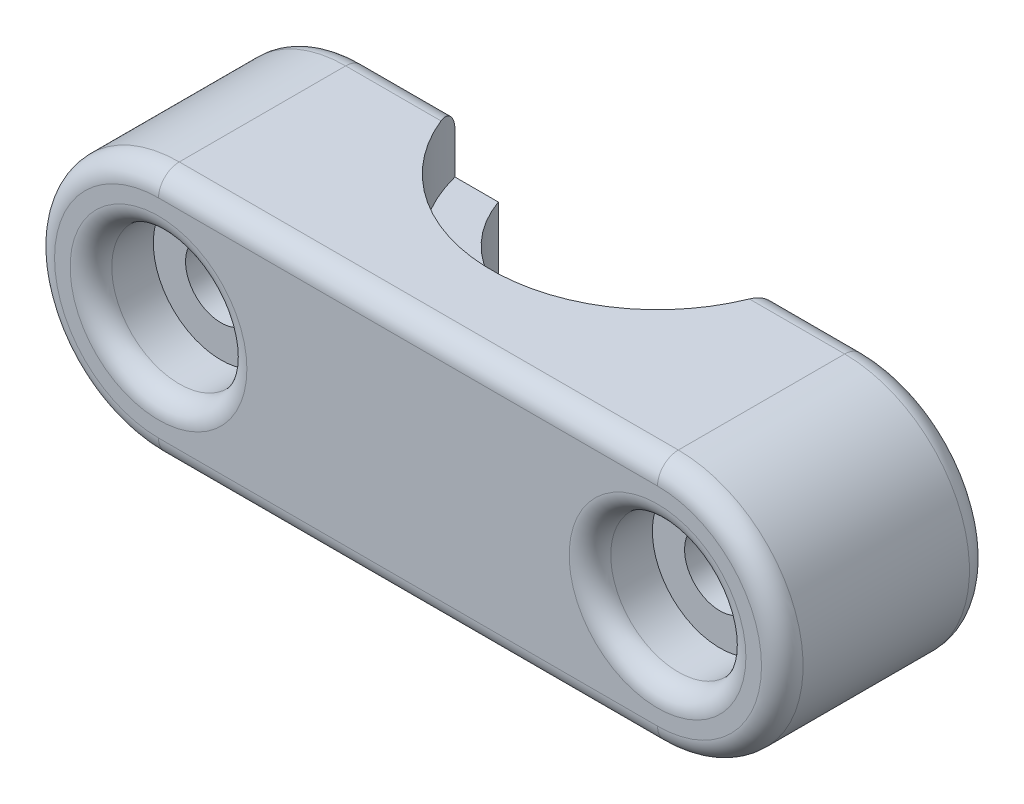
ISO-10303-21;
HEADER;
FILE_DESCRIPTION(('STEP AP214'),'2;1');
FILE_NAME('part.step','',(''),(''),'','','');
FILE_SCHEMA(('AUTOMOTIVE_DESIGN { 1 0 10303 214 1 1 1 1 }'));
ENDSEC;
DATA;
#1=APPLICATION_CONTEXT('core data for automotive mechanical design processes');
#2=APPLICATION_PROTOCOL_DEFINITION('international standard','automotive_design',2000,#1);
#3=PRODUCT_CONTEXT('',#1,'mechanical');
#4=PRODUCT('Part','Part','',(#3));
#5=PRODUCT_RELATED_PRODUCT_CATEGORY('part','',(#4));
#6=PRODUCT_DEFINITION_FORMATION('','',#4);
#7=PRODUCT_DEFINITION_CONTEXT('part definition',#1,'design');
#8=PRODUCT_DEFINITION('design','',#6,#7);
#9=PRODUCT_DEFINITION_SHAPE('','',#8);
#10=(LENGTH_UNIT() NAMED_UNIT(*) SI_UNIT(.MILLI.,.METRE.));
#11=(NAMED_UNIT(*) PLANE_ANGLE_UNIT() SI_UNIT($,.RADIAN.));
#12=(NAMED_UNIT(*) SI_UNIT($,.STERADIAN.) SOLID_ANGLE_UNIT());
#13=UNCERTAINTY_MEASURE_WITH_UNIT(LENGTH_MEASURE(1.E-05),#10,'distance_accuracy_value','');
#14=(GEOMETRIC_REPRESENTATION_CONTEXT(3) GLOBAL_UNCERTAINTY_ASSIGNED_CONTEXT((#13)) GLOBAL_UNIT_ASSIGNED_CONTEXT((#10,
#11,#12)) REPRESENTATION_CONTEXT('',''));
#15=CARTESIAN_POINT('',(0.,0.,0.));
#16=DIRECTION('',(0.,0.,1.));
#17=DIRECTION('',(1.,0.,0.));
#18=AXIS2_PLACEMENT_3D('',#15,#16,#17);
#19=CARTESIAN_POINT('',(-12.,0.,2.));
#20=DIRECTION('',(0.,0.,1.));
#21=DIRECTION('',(1.,0.,0.));
#22=AXIS2_PLACEMENT_3D('',#19,#20,#21);
#23=PLANE('',#22);
#24=CARTESIAN_POINT('',(12.,0.,2.00000000000001));
#25=DIRECTION('',(0.,0.,1.));
#26=DIRECTION('',(1.,0.,0.));
#27=AXIS2_PLACEMENT_3D('',#24,#25,#26);
#28=CIRCLE('',#27,1.70000000000001);
#29=CARTESIAN_POINT('',(13.7,0.,2.00000000000001));
#30=VERTEX_POINT('',#29);
#31=EDGE_CURVE('E385',#30,#30,#28,.T.);
#32=ORIENTED_EDGE('',*,*,#31,.T.);
#33=EDGE_LOOP('',(#32));
#34=FACE_BOUND('',#33,.T.);
#35=DIRECTION('',(0.,1.,0.));
#36=VECTOR('',#35,1.);
#37=CARTESIAN_POINT('',(7.74596669241484,6.,2.));
#38=LINE('',#37,#36);
#39=CARTESIAN_POINT('',(7.74596669241484,-3.,2.));
#40=VERTEX_POINT('',#39);
#41=CARTESIAN_POINT('',(7.74596669241484,-5.,2.));
#42=VERTEX_POINT('',#41);
#43=EDGE_CURVE('E413',#40,#42,#38,.F.);
#44=ORIENTED_EDGE('',*,*,#43,.F.);
#45=DIRECTION('',(1.,0.,0.));
#46=VECTOR('',#45,1.);
#47=CARTESIAN_POINT('',(-12.,-3.,2.));
#48=LINE('',#47,#46);
#49=CARTESIAN_POINT('',(5.65685424949238,-3.,2.));
#50=VERTEX_POINT('',#49);
#51=EDGE_CURVE('E11',#50,#40,#48,.T.);
#52=ORIENTED_EDGE('',*,*,#51,.F.);
#53=DIRECTION('',(0.,1.,0.));
#54=VECTOR('',#53,1.);
#55=CARTESIAN_POINT('',(5.65685424949238,6.,2.));
#56=LINE('',#55,#54);
#57=CARTESIAN_POINT('',(5.65685424949238,3.,2.));
#58=VERTEX_POINT('',#57);
#59=EDGE_CURVE('E39',#58,#50,#56,.F.);
#60=ORIENTED_EDGE('',*,*,#59,.F.);
#61=DIRECTION('',(-1.,0.,0.));
#62=VECTOR('',#61,1.);
#63=CARTESIAN_POINT('',(-12.,3.,2.));
#64=LINE('',#63,#62);
#65=CARTESIAN_POINT('',(7.74596669241483,3.,2.));
#66=VERTEX_POINT('',#65);
#67=EDGE_CURVE('E666',#66,#58,#64,.T.);
#68=ORIENTED_EDGE('',*,*,#67,.F.);
#69=DIRECTION('',(0.,1.,0.));
#70=VECTOR('',#69,1.);
#71=CARTESIAN_POINT('',(7.74596669241484,6.,2.));
#72=LINE('',#71,#70);
#73=CARTESIAN_POINT('',(7.74596669241484,5.,2.));
#74=VERTEX_POINT('',#73);
#75=EDGE_CURVE('E411',#74,#66,#72,.F.);
#76=ORIENTED_EDGE('',*,*,#75,.F.);
#77=DIRECTION('',(-1.,0.,0.));
#78=VECTOR('',#77,1.);
#79=CARTESIAN_POINT('',(-12.,5.,2.));
#80=LINE('',#79,#78);
#81=CARTESIAN_POINT('',(12.,5.,2.));
#82=VERTEX_POINT('',#81);
#83=EDGE_CURVE('E166',#74,#82,#80,.F.);
#84=ORIENTED_EDGE('',*,*,#83,.T.);
#85=CARTESIAN_POINT('',(12.,0.,2.));
#86=DIRECTION('',(0.,0.,1.));
#87=DIRECTION('',(1.,0.,0.));
#88=AXIS2_PLACEMENT_3D('',#85,#86,#87);
#89=CIRCLE('',#88,5.);
#90=CARTESIAN_POINT('',(12.,-5.,2.));
#91=VERTEX_POINT('',#90);
#92=EDGE_CURVE('E331',#82,#91,#89,.F.);
#93=ORIENTED_EDGE('',*,*,#92,.T.);
#94=DIRECTION('',(1.,0.,0.));
#95=VECTOR('',#94,1.);
#96=CARTESIAN_POINT('',(-12.,-5.,2.));
#97=LINE('',#96,#95);
#98=EDGE_CURVE('E337',#91,#42,#97,.F.);
#99=ORIENTED_EDGE('',*,*,#98,.T.);
#100=EDGE_LOOP('',(#44,#52,#60,#68,#76,#84,#93,#99));
#101=FACE_BOUND('',#100,.T.);
#102=ADVANCED_FACE('F35',(#34,#101),#23,.F.);
#103=CARTESIAN_POINT('',(-12.,0.,2.00000000000001));
#104=DIRECTION('',(0.,0.,1.));
#105=DIRECTION('',(1.,0.,0.));
#106=AXIS2_PLACEMENT_3D('',#103,#104,#105);
#107=CIRCLE('',#106,1.70000000000001);
#108=CARTESIAN_POINT('',(-10.3,0.,2.00000000000001));
#109=VERTEX_POINT('',#108);
#110=EDGE_CURVE('E426',#109,#109,#107,.T.);
#111=ORIENTED_EDGE('',*,*,#110,.T.);
#112=EDGE_LOOP('',(#111));
#113=FACE_BOUND('',#112,.T.);
#114=DIRECTION('',(0.,1.,0.));
#115=VECTOR('',#114,1.);
#116=CARTESIAN_POINT('',(-7.74596669241484,6.,2.));
#117=LINE('',#116,#115);
#118=CARTESIAN_POINT('',(-7.74596669241484,-5.,2.));
#119=VERTEX_POINT('',#118);
#120=CARTESIAN_POINT('',(-7.74596669241484,-3.,2.));
#121=VERTEX_POINT('',#120);
#122=EDGE_CURVE('E203',#119,#121,#117,.T.);
#123=ORIENTED_EDGE('',*,*,#122,.F.);
#124=CARTESIAN_POINT('',(-12.,-5.,2.));
#125=VERTEX_POINT('',#124);
#126=EDGE_CURVE('E339',#119,#125,#97,.F.);
#127=ORIENTED_EDGE('',*,*,#126,.T.);
#128=CARTESIAN_POINT('',(-12.,0.,2.));
#129=DIRECTION('',(0.,0.,1.));
#130=DIRECTION('',(1.,0.,0.));
#131=AXIS2_PLACEMENT_3D('',#128,#129,#130);
#132=CIRCLE('',#131,5.);
#133=CARTESIAN_POINT('',(-12.,5.,2.));
#134=VERTEX_POINT('',#133);
#135=EDGE_CURVE('E394',#125,#134,#132,.F.);
#136=ORIENTED_EDGE('',*,*,#135,.T.);
#137=CARTESIAN_POINT('',(-7.74596669241484,5.,2.));
#138=VERTEX_POINT('',#137);
#139=EDGE_CURVE('E392',#134,#138,#80,.F.);
#140=ORIENTED_EDGE('',*,*,#139,.T.);
#141=DIRECTION('',(0.,1.,0.));
#142=VECTOR('',#141,1.);
#143=CARTESIAN_POINT('',(-7.74596669241484,6.,2.));
#144=LINE('',#143,#142);
#145=CARTESIAN_POINT('',(-7.74596669241483,3.,2.));
#146=VERTEX_POINT('',#145);
#147=EDGE_CURVE('E51',#146,#138,#144,.T.);
#148=ORIENTED_EDGE('',*,*,#147,.F.);
#149=CARTESIAN_POINT('',(-5.65685424949238,3.,2.));
#150=VERTEX_POINT('',#149);
#151=EDGE_CURVE('E256',#150,#146,#64,.T.);
#152=ORIENTED_EDGE('',*,*,#151,.F.);
#153=DIRECTION('',(0.,1.,0.));
#154=VECTOR('',#153,1.);
#155=CARTESIAN_POINT('',(-5.65685424949238,6.,2.));
#156=LINE('',#155,#154);
#157=CARTESIAN_POINT('',(-5.65685424949238,-3.,2.));
#158=VERTEX_POINT('',#157);
#159=EDGE_CURVE('E665',#158,#150,#156,.T.);
#160=ORIENTED_EDGE('',*,*,#159,.F.);
#161=EDGE_CURVE('E44',#121,#158,#48,.T.);
#162=ORIENTED_EDGE('',*,*,#161,.F.);
#163=EDGE_LOOP('',(#123,#127,#136,#140,#148,#152,#160,#162));
#164=FACE_BOUND('',#163,.T.);
#165=ADVANCED_FACE('F263',(#113,#164),#23,.F.);
#166=CARTESIAN_POINT('',(-12.,-5.,3.));
#167=DIRECTION('',(1.,0.,0.));
#168=DIRECTION('',(0.,0.,-1.));
#169=AXIS2_PLACEMENT_3D('',#166,#167,#168);
#170=CYLINDRICAL_SURFACE('',#169,1.);
#171=ORIENTED_EDGE('',*,*,#126,.F.);
#172=CARTESIAN_POINT('',(-7.74596669241484,-5.,2.));
#173=CARTESIAN_POINT('',(-7.74596590811307,-5.02738582214099,1.99999975574434));
#174=CARTESIAN_POINT('',(-7.74567612373196,-5.05475840103605,2.00112573061437));
#175=CARTESIAN_POINT('',(-7.74451529611086,-5.10930480824231,2.00561481229999));
#176=CARTESIAN_POINT('',(-7.74364430065713,-5.13647865270746,2.00897773519721));
#177=CARTESIAN_POINT('',(-7.7401597577425,-5.2173294221264,2.0223791801416));
#178=CARTESIAN_POINT('',(-7.73667467377332,-5.27045994710166,2.03573053617178));
#179=CARTESIAN_POINT('',(-7.72735480875871,-5.37364035695396,2.0708242437704));
#180=CARTESIAN_POINT('',(-7.72151928098614,-5.42368925697934,2.09256926188212));
#181=CARTESIAN_POINT('',(-7.70747556131186,-5.51934443509307,2.14371662985033));
#182=CARTESIAN_POINT('',(-7.69926743296545,-5.56495083213984,2.17311877459184));
#183=CARTESIAN_POINT('',(-7.68040036627709,-5.65089579202369,2.23888965750632));
#184=CARTESIAN_POINT('',(-7.66972065339077,-5.69118487894517,2.27531698590942));
#185=CARTESIAN_POINT('',(-7.64600695047903,-5.76504650369445,2.35377449769379));
#186=CARTESIAN_POINT('',(-7.63297275847399,-5.79861846477065,2.39580516167759));
#187=CARTESIAN_POINT('',(-7.60426737354902,-5.85920569426005,2.4854359449505));
#188=CARTESIAN_POINT('',(-7.5885308208652,-5.88600326891396,2.5331619782814));
#189=CARTESIAN_POINT('',(-7.55491673647169,-5.93129591208351,2.63171905478925));
#190=CARTESIAN_POINT('',(-7.53703825159489,-5.94978726678922,2.68255147535269));
#191=CARTESIAN_POINT('',(-7.50236681209185,-5.97607343350546,2.77788527302038));
#192=CARTESIAN_POINT('',(-7.48583177595668,-5.98507819605311,2.82215380184913));
#193=CARTESIAN_POINT('',(-7.4517336875297,-5.99704114213729,2.91100744427928));
#194=CARTESIAN_POINT('',(-7.43417280643269,-6.0000116519085,2.95559172544545));
#195=CARTESIAN_POINT('',(-7.41619848709567,-6.,3.));
#196=B_SPLINE_CURVE_WITH_KNOTS('',3,(#172,#173,#174,#175,#176,#177,#178,#179,#180,#181,#182,
#183,#184,#185,#186,#187,#188,#189,#190,#191,#192,#193,#194,#195),.UNSPECIFIED.,.F.,.F.,(4,2,2,
2,2,2,2,2,2,2,2,4),(0.,0.0821065532942152,0.164206356749745,0.328037664132088,0.491921061208497,
0.655800068716023,0.821110062278596,0.986434243743681,1.15653951780642,1.32672077244541,
1.47065242816036,1.61428977624112),.UNSPECIFIED.);
#197=CARTESIAN_POINT('',(-7.41619848709567,-6.,3.));
#198=VERTEX_POINT('',#197);
#199=EDGE_CURVE('E250',#119,#198,#196,.T.);
#200=ORIENTED_EDGE('',*,*,#199,.T.);
#201=DIRECTION('',(1.,0.,0.));
#202=VECTOR('',#201,1.);
#203=CARTESIAN_POINT('',(-12.,-6.,3.));
#204=LINE('',#203,#202);
#205=CARTESIAN_POINT('',(-12.,-6.,3.));
#206=VERTEX_POINT('',#205);
#207=EDGE_CURVE('E347',#206,#198,#204,.T.);
#208=ORIENTED_EDGE('',*,*,#207,.F.);
#209=CARTESIAN_POINT('',(-12.,-5.,3.));
#210=DIRECTION('',(1.,0.,0.));
#211=DIRECTION('',(0.,0.,-1.));
#212=AXIS2_PLACEMENT_3D('',#209,#210,#211);
#213=CIRCLE('',#212,1.);
#214=EDGE_CURVE('E196',#206,#125,#213,.T.);
#215=ORIENTED_EDGE('',*,*,#214,.T.);
#216=EDGE_LOOP('',(#171,#200,#208,#215));
#217=FACE_BOUND('',#216,.T.);
#218=ADVANCED_FACE('F258',(#217),#170,.T.);
#219=CARTESIAN_POINT('',(7.41619848709567,-6.,3.));
#220=VERTEX_POINT('',#219);
#221=CARTESIAN_POINT('',(12.,-6.,3.));
#222=VERTEX_POINT('',#221);
#223=EDGE_CURVE('E343',#220,#222,#204,.T.);
#224=ORIENTED_EDGE('',*,*,#223,.F.);
#225=CARTESIAN_POINT('',(7.41619848709567,-6.,3.));
#226=CARTESIAN_POINT('',(7.43940864314942,-6.0000448056161,2.9426983015686));
#227=CARTESIAN_POINT('',(7.46192085120009,-5.99507436045397,2.88506225060058));
#228=CARTESIAN_POINT('',(7.50510981946608,-5.97508333474305,2.77073057161981));
#229=CARTESIAN_POINT('',(7.52578290175352,-5.96004310648094,2.7140370045934));
#230=CARTESIAN_POINT('',(7.56480123411529,-5.91984961819868,2.60331859705918));
#231=CARTESIAN_POINT('',(7.58314139747348,-5.89467474158461,2.54929973988868));
#232=CARTESIAN_POINT('',(7.61707721353945,-5.83467332246032,2.44603350465761));
#233=CARTESIAN_POINT('',(7.63267618351234,-5.79985857899599,2.39678039222226));
#234=CARTESIAN_POINT('',(7.66022137814829,-5.72339548685711,2.30718485828725));
#235=CARTESIAN_POINT('',(7.67231160806789,-5.68217765975173,2.26651933976322));
#236=CARTESIAN_POINT('',(7.69375399432059,-5.59288486793609,2.19263168985751));
#237=CARTESIAN_POINT('',(7.70310560197218,-5.54480853199261,2.15941105036591));
#238=CARTESIAN_POINT('',(7.71867906549591,-5.4456253562593,2.10304824401718));
#239=CARTESIAN_POINT('',(7.72502591807901,-5.39476233985664,2.07951023750919));
#240=CARTESIAN_POINT('',(7.73522968452694,-5.28962149436327,2.04122959348053));
#241=CARTESIAN_POINT('',(7.73908933051437,-5.23534748434954,2.02647730646372));
#242=CARTESIAN_POINT('',(7.74313914317043,-5.15049890584539,2.01092646188286));
#243=CARTESIAN_POINT('',(7.7442006780839,-5.12053186376731,2.00683042456085));
#244=CARTESIAN_POINT('',(7.74561336695637,-5.06038141720549,2.00136878518588));
#245=CARTESIAN_POINT('',(7.74596564614401,-5.03019843179544,1.99999885822035));
#246=CARTESIAN_POINT('',(7.74596669241484,-5.,2.));
#247=B_SPLINE_CURVE_WITH_KNOTS('',3,(#225,#226,#227,#228,#229,#230,#231,#232,#233,#234,#235,
#236,#237,#238,#239,#240,#241,#242,#243,#244,#245,#246),.UNSPECIFIED.,.F.,.F.,(4,2,2,2,2,2,2,2,
2,2,4),(0.,0.185341524510172,0.371045737151088,0.55714816226951,0.743023800261782,
0.919573159707415,1.0961578665614,1.2645560785068,1.43276899326838,1.52344468236252,
1.61397640146876),.UNSPECIFIED.);
#248=EDGE_CURVE('E167',#220,#42,#247,.T.);
#249=ORIENTED_EDGE('',*,*,#248,.T.);
#250=ORIENTED_EDGE('',*,*,#98,.F.);
#251=CARTESIAN_POINT('',(12.,-5.,3.));
#252=DIRECTION('',(1.,0.,0.));
#253=DIRECTION('',(0.,0.,-1.));
#254=AXIS2_PLACEMENT_3D('',#251,#252,#253);
#255=CIRCLE('',#254,1.);
#256=EDGE_CURVE('E190',#222,#91,#255,.T.);
#257=ORIENTED_EDGE('',*,*,#256,.F.);
#258=EDGE_LOOP('',(#224,#249,#250,#257));
#259=FACE_BOUND('',#258,.T.);
#260=ADVANCED_FACE('F262',(#259),#170,.T.);
#261=CARTESIAN_POINT('',(-12.,5.,3.));
#262=DIRECTION('',(-1.,0.,0.));
#263=DIRECTION('',(0.,0.,1.));
#264=AXIS2_PLACEMENT_3D('',#261,#262,#263);
#265=CYLINDRICAL_SURFACE('',#264,1.);
#266=ORIENTED_EDGE('',*,*,#83,.F.);
#267=CARTESIAN_POINT('',(7.74596669241484,5.,2.));
#268=CARTESIAN_POINT('',(7.74596590811307,5.02738582214099,1.99999975574434));
#269=CARTESIAN_POINT('',(7.74567612373196,5.05475840103605,2.00112573061437));
#270=CARTESIAN_POINT('',(7.74451529611086,5.10930480824231,2.00561481229999));
#271=CARTESIAN_POINT('',(7.74364430065713,5.13647865270746,2.00897773519721));
#272=CARTESIAN_POINT('',(7.7401597577425,5.2173294221264,2.0223791801416));
#273=CARTESIAN_POINT('',(7.73667467377332,5.27045994710166,2.03573053617178));
#274=CARTESIAN_POINT('',(7.72735480875871,5.37364035695396,2.0708242437704));
#275=CARTESIAN_POINT('',(7.72151928098614,5.42368925697933,2.09256926188212));
#276=CARTESIAN_POINT('',(7.70747556131186,5.51934443509306,2.14371662985033));
#277=CARTESIAN_POINT('',(7.69926743296545,5.56495083213984,2.17311877459184));
#278=CARTESIAN_POINT('',(7.68040036627709,5.65089579202369,2.23888965750632));
#279=CARTESIAN_POINT('',(7.66972065339077,5.69118487894517,2.27531698590942));
#280=CARTESIAN_POINT('',(7.64600695047903,5.76504650369445,2.35377449769379));
#281=CARTESIAN_POINT('',(7.63297275847399,5.79861846477065,2.39580516167759));
#282=CARTESIAN_POINT('',(7.60426737354902,5.85920569426005,2.4854359449505));
#283=CARTESIAN_POINT('',(7.5885308208652,5.88600326891396,2.5331619782814));
#284=CARTESIAN_POINT('',(7.55491673647169,5.93129591208351,2.63171905478925));
#285=CARTESIAN_POINT('',(7.53703825159489,5.94978726678922,2.68255147535269));
#286=CARTESIAN_POINT('',(7.50236681209185,5.97607343350546,2.77788527302038));
#287=CARTESIAN_POINT('',(7.48583177595668,5.9850781960531,2.82215380184913));
#288=CARTESIAN_POINT('',(7.4517336875297,5.99704114213729,2.91100744427928));
#289=CARTESIAN_POINT('',(7.43417280643269,6.0000116519085,2.95559172544545));
#290=CARTESIAN_POINT('',(7.41619848709567,6.,3.));
#291=B_SPLINE_CURVE_WITH_KNOTS('',3,(#267,#268,#269,#270,#271,#272,#273,#274,#275,#276,#277,
#278,#279,#280,#281,#282,#283,#284,#285,#286,#287,#288,#289,#290),.UNSPECIFIED.,.F.,.F.,(4,2,2,
2,2,2,2,2,2,2,2,4),(0.,0.0821065532942152,0.164206356749745,0.328037664132088,0.491921061208497,
0.655800068716023,0.821110062278596,0.986434243743681,1.15653951780642,1.32672077244541,
1.47065242816036,1.61428977624112),.UNSPECIFIED.);
#292=CARTESIAN_POINT('',(7.41619848709567,6.,3.));
#293=VERTEX_POINT('',#292);
#294=EDGE_CURVE('E151',#74,#293,#291,.T.);
#295=ORIENTED_EDGE('',*,*,#294,.T.);
#296=DIRECTION('',(-1.,0.,0.));
#297=VECTOR('',#296,1.);
#298=CARTESIAN_POINT('',(-12.,6.,3.));
#299=LINE('',#298,#297);
#300=CARTESIAN_POINT('',(12.,6.,3.));
#301=VERTEX_POINT('',#300);
#302=EDGE_CURVE('E164',#301,#293,#299,.T.);
#303=ORIENTED_EDGE('',*,*,#302,.F.);
#304=CARTESIAN_POINT('',(12.,5.,3.));
#305=DIRECTION('',(1.,0.,0.));
#306=DIRECTION('',(0.,0.,-1.));
#307=AXIS2_PLACEMENT_3D('',#304,#305,#306);
#308=CIRCLE('',#307,1.);
#309=EDGE_CURVE('E188',#82,#301,#308,.T.);
#310=ORIENTED_EDGE('',*,*,#309,.F.);
#311=EDGE_LOOP('',(#266,#295,#303,#310));
#312=FACE_BOUND('',#311,.T.);
#313=ADVANCED_FACE('F162',(#312),#265,.T.);
#314=CARTESIAN_POINT('',(-7.41619848709567,6.,3.));
#315=VERTEX_POINT('',#314);
#316=CARTESIAN_POINT('',(-12.,6.,3.));
#317=VERTEX_POINT('',#316);
#318=EDGE_CURVE('E175',#315,#317,#299,.T.);
#319=ORIENTED_EDGE('',*,*,#318,.F.);
#320=CARTESIAN_POINT('',(-7.41619848709567,6.,3.));
#321=CARTESIAN_POINT('',(-7.43940864314943,6.0000448056161,2.9426983015686));
#322=CARTESIAN_POINT('',(-7.46192085120009,5.99507436045397,2.88506225060059));
#323=CARTESIAN_POINT('',(-7.50510981946608,5.97508333474304,2.77073057161981));
#324=CARTESIAN_POINT('',(-7.52578290175352,5.96004310648094,2.7140370045934));
#325=CARTESIAN_POINT('',(-7.56480123411529,5.91984961819868,2.60331859705918));
#326=CARTESIAN_POINT('',(-7.58314139747348,5.89467474158461,2.54929973988868));
#327=CARTESIAN_POINT('',(-7.61707721353945,5.83467332246032,2.44603350465761));
#328=CARTESIAN_POINT('',(-7.63267618351234,5.79985857899599,2.39678039222226));
#329=CARTESIAN_POINT('',(-7.66022137814829,5.72339548685711,2.30718485828725));
#330=CARTESIAN_POINT('',(-7.67231160806789,5.68217765975173,2.26651933976322));
#331=CARTESIAN_POINT('',(-7.69375399432059,5.59288486793609,2.19263168985751));
#332=CARTESIAN_POINT('',(-7.70310560197218,5.54480853199261,2.15941105036591));
#333=CARTESIAN_POINT('',(-7.71867906549591,5.4456253562593,2.10304824401718));
#334=CARTESIAN_POINT('',(-7.72502591807901,5.39476233985664,2.07951023750919));
#335=CARTESIAN_POINT('',(-7.73522968452694,5.28962149436327,2.04122959348053));
#336=CARTESIAN_POINT('',(-7.73908933051437,5.23534748434953,2.02647730646372));
#337=CARTESIAN_POINT('',(-7.74313914317043,5.15049890584539,2.01092646188286));
#338=CARTESIAN_POINT('',(-7.7442006780839,5.1205318637673,2.00683042456085));
#339=CARTESIAN_POINT('',(-7.74561336695637,5.06038141720549,2.00136878518588));
#340=CARTESIAN_POINT('',(-7.74596564614401,5.03019843179544,1.99999885822035));
#341=CARTESIAN_POINT('',(-7.74596669241484,5.,2.));
#342=B_SPLINE_CURVE_WITH_KNOTS('',3,(#320,#321,#322,#323,#324,#325,#326,#327,#328,#329,#330,
#331,#332,#333,#334,#335,#336,#337,#338,#339,#340,#341),.UNSPECIFIED.,.F.,.F.,(4,2,2,2,2,2,2,2,
2,2,4),(0.,0.185341524510173,0.371045737151088,0.55714816226951,0.743023800261782,
0.919573159707416,1.0961578665614,1.2645560785068,1.43276899326838,1.52344468236252,
1.61397640146876),.UNSPECIFIED.);
#343=EDGE_CURVE('E153',#315,#138,#342,.T.);
#344=ORIENTED_EDGE('',*,*,#343,.T.);
#345=ORIENTED_EDGE('',*,*,#139,.F.);
#346=CARTESIAN_POINT('',(-12.,5.,3.));
#347=DIRECTION('',(1.,0.,0.));
#348=DIRECTION('',(0.,0.,-1.));
#349=AXIS2_PLACEMENT_3D('',#346,#347,#348);
#350=CIRCLE('',#349,1.);
#351=EDGE_CURVE('E193',#134,#317,#350,.T.);
#352=ORIENTED_EDGE('',*,*,#351,.T.);
#353=EDGE_LOOP('',(#319,#344,#345,#352));
#354=FACE_BOUND('',#353,.T.);
#355=ADVANCED_FACE('F320',(#354),#265,.T.);
#356=CARTESIAN_POINT('',(-12.,0.,12.));
#357=DIRECTION('',(0.,0.,-1.));
#358=DIRECTION('',(-1.,0.,0.));
#359=AXIS2_PLACEMENT_3D('',#356,#357,#358);
#360=CYLINDRICAL_SURFACE('',#359,6.);
#361=DIRECTION('',(0.,0.,-1.));
#362=VECTOR('',#361,1.);
#363=CARTESIAN_POINT('',(-12.,6.,12.));
#364=LINE('',#363,#362);
#365=CARTESIAN_POINT('',(-12.,6.,11.));
#366=VERTEX_POINT('',#365);
#367=EDGE_CURVE('E381',#366,#317,#364,.T.);
#368=ORIENTED_EDGE('',*,*,#367,.T.);
#369=CARTESIAN_POINT('',(-12.,0.,3.));
#370=DIRECTION('',(0.,0.,1.));
#371=DIRECTION('',(1.,0.,0.));
#372=AXIS2_PLACEMENT_3D('',#369,#370,#371);
#373=CIRCLE('',#372,6.);
#374=EDGE_CURVE('E352',#317,#206,#373,.T.);
#375=ORIENTED_EDGE('',*,*,#374,.T.);
#376=DIRECTION('',(0.,0.,-1.));
#377=VECTOR('',#376,1.);
#378=CARTESIAN_POINT('',(-12.,-6.,12.));
#379=LINE('',#378,#377);
#380=CARTESIAN_POINT('',(-12.,-6.,11.));
#381=VERTEX_POINT('',#380);
#382=EDGE_CURVE('E377',#381,#206,#379,.T.);
#383=ORIENTED_EDGE('',*,*,#382,.F.);
#384=CARTESIAN_POINT('',(-12.,0.,11.));
#385=DIRECTION('',(0.,0.,1.));
#386=DIRECTION('',(1.,0.,0.));
#387=AXIS2_PLACEMENT_3D('',#384,#385,#386);
#388=CIRCLE('',#387,6.);
#389=EDGE_CURVE('E350',#381,#366,#388,.F.);
#390=ORIENTED_EDGE('',*,*,#389,.T.);
#391=EDGE_LOOP('',(#368,#375,#383,#390));
#392=FACE_BOUND('',#391,.T.);
#393=ADVANCED_FACE('F317',(#392),#360,.T.);
#394=CARTESIAN_POINT('',(-12.,-6.,12.));
#395=DIRECTION('',(0.,1.,0.));
#396=DIRECTION('',(0.,0.,1.));
#397=AXIS2_PLACEMENT_3D('',#394,#395,#396);
#398=PLANE('',#397);
#399=CARTESIAN_POINT('',(0.,-6.,0.));
#400=DIRECTION('',(0.,1.,0.));
#401=DIRECTION('',(0.,0.,1.));
#402=AXIS2_PLACEMENT_3D('',#399,#400,#401);
#403=CIRCLE('',#402,8.);
#404=EDGE_CURVE('E406',#198,#220,#403,.T.);
#405=ORIENTED_EDGE('',*,*,#404,.T.);
#406=ORIENTED_EDGE('',*,*,#223,.T.);
#407=DIRECTION('',(0.,0.,-1.));
#408=VECTOR('',#407,1.);
#409=CARTESIAN_POINT('',(12.,-6.,12.));
#410=LINE('',#409,#408);
#411=CARTESIAN_POINT('',(12.,-6.,11.));
#412=VERTEX_POINT('',#411);
#413=EDGE_CURVE('E382',#412,#222,#410,.T.);
#414=ORIENTED_EDGE('',*,*,#413,.F.);
#415=DIRECTION('',(1.,0.,0.));
#416=VECTOR('',#415,1.);
#417=CARTESIAN_POINT('',(-12.,-6.,11.));
#418=LINE('',#417,#416);
#419=EDGE_CURVE('E341',#412,#381,#418,.F.);
#420=ORIENTED_EDGE('',*,*,#419,.T.);
#421=ORIENTED_EDGE('',*,*,#382,.T.);
#422=ORIENTED_EDGE('',*,*,#207,.T.);
#423=EDGE_LOOP('',(#405,#406,#414,#420,#421,#422));
#424=FACE_BOUND('',#423,.T.);
#425=ADVANCED_FACE('F313',(#424),#398,.F.);
#426=CARTESIAN_POINT('',(12.,0.,12.));
#427=DIRECTION('',(0.,0.,-1.));
#428=DIRECTION('',(-1.,0.,0.));
#429=AXIS2_PLACEMENT_3D('',#426,#427,#428);
#430=CYLINDRICAL_SURFACE('',#429,6.);
#431=ORIENTED_EDGE('',*,*,#413,.T.);
#432=CARTESIAN_POINT('',(12.,0.,3.));
#433=DIRECTION('',(0.,0.,1.));
#434=DIRECTION('',(1.,0.,0.));
#435=AXIS2_PLACEMENT_3D('',#432,#433,#434);
#436=CIRCLE('',#435,6.);
#437=EDGE_CURVE('E332',#222,#301,#436,.T.);
#438=ORIENTED_EDGE('',*,*,#437,.T.);
#439=DIRECTION('',(0.,0.,-1.));
#440=VECTOR('',#439,1.);
#441=CARTESIAN_POINT('',(12.,6.,12.));
#442=LINE('',#441,#440);
#443=CARTESIAN_POINT('',(12.,6.,11.));
#444=VERTEX_POINT('',#443);
#445=EDGE_CURVE('E173',#444,#301,#442,.T.);
#446=ORIENTED_EDGE('',*,*,#445,.F.);
#447=CARTESIAN_POINT('',(12.,0.,11.));
#448=DIRECTION('',(0.,0.,1.));
#449=DIRECTION('',(1.,0.,0.));
#450=AXIS2_PLACEMENT_3D('',#447,#448,#449);
#451=CIRCLE('',#450,6.);
#452=EDGE_CURVE('E374',#444,#412,#451,.F.);
#453=ORIENTED_EDGE('',*,*,#452,.T.);
#454=EDGE_LOOP('',(#431,#438,#446,#453));
#455=FACE_BOUND('',#454,.T.);
#456=ADVANCED_FACE('F310',(#455),#430,.T.);
#457=CARTESIAN_POINT('',(-12.,6.,12.));
#458=DIRECTION('',(0.,-1.,0.));
#459=DIRECTION('',(0.,0.,-1.));
#460=AXIS2_PLACEMENT_3D('',#457,#458,#459);
#461=PLANE('',#460);
#462=CARTESIAN_POINT('',(0.,6.,0.));
#463=DIRECTION('',(0.,1.,0.));
#464=DIRECTION('',(0.,0.,1.));
#465=AXIS2_PLACEMENT_3D('',#462,#463,#464);
#466=CIRCLE('',#465,8.);
#467=EDGE_CURVE('E148',#315,#293,#466,.T.);
#468=ORIENTED_EDGE('',*,*,#467,.F.);
#469=ORIENTED_EDGE('',*,*,#318,.T.);
#470=ORIENTED_EDGE('',*,*,#367,.F.);
#471=DIRECTION('',(-1.,0.,0.));
#472=VECTOR('',#471,1.);
#473=CARTESIAN_POINT('',(12.,6.,11.));
#474=LINE('',#473,#472);
#475=EDGE_CURVE('E174',#366,#444,#474,.F.);
#476=ORIENTED_EDGE('',*,*,#475,.T.);
#477=ORIENTED_EDGE('',*,*,#445,.T.);
#478=ORIENTED_EDGE('',*,*,#302,.T.);
#479=EDGE_LOOP('',(#468,#469,#470,#476,#477,#478));
#480=FACE_BOUND('',#479,.T.);
#481=ADVANCED_FACE('F170',(#480),#461,.F.);
#482=CARTESIAN_POINT('',(-12.,0.,12.));
#483=DIRECTION('',(0.,0.,1.));
#484=DIRECTION('',(1.,0.,0.));
#485=AXIS2_PLACEMENT_3D('',#482,#483,#484);
#486=PLANE('',#485);
#487=CARTESIAN_POINT('',(12.,0.,12.));
#488=DIRECTION('',(0.,0.,1.));
#489=DIRECTION('',(1.,0.,0.));
#490=AXIS2_PLACEMENT_3D('',#487,#488,#489);
#491=CIRCLE('',#490,5.);
#492=CARTESIAN_POINT('',(12.,-5.,12.));
#493=VERTEX_POINT('',#492);
#494=CARTESIAN_POINT('',(12.,5.,12.));
#495=VERTEX_POINT('',#494);
#496=EDGE_CURVE('E59',#493,#495,#491,.T.);
#497=ORIENTED_EDGE('',*,*,#496,.T.);
#498=DIRECTION('',(-1.,0.,0.));
#499=VECTOR('',#498,1.);
#500=CARTESIAN_POINT('',(-12.,5.,12.));
#501=LINE('',#500,#499);
#502=CARTESIAN_POINT('',(-12.,5.,12.));
#503=VERTEX_POINT('',#502);
#504=EDGE_CURVE('E179',#495,#503,#501,.T.);
#505=ORIENTED_EDGE('',*,*,#504,.T.);
#506=CARTESIAN_POINT('',(-12.,0.,12.));
#507=DIRECTION('',(0.,0.,1.));
#508=DIRECTION('',(1.,0.,0.));
#509=AXIS2_PLACEMENT_3D('',#506,#507,#508);
#510=CIRCLE('',#509,5.);
#511=CARTESIAN_POINT('',(-12.,-5.,12.));
#512=VERTEX_POINT('',#511);
#513=EDGE_CURVE('E360',#503,#512,#510,.T.);
#514=ORIENTED_EDGE('',*,*,#513,.T.);
#515=DIRECTION('',(1.,0.,0.));
#516=VECTOR('',#515,1.);
#517=CARTESIAN_POINT('',(12.,-5.,12.));
#518=LINE('',#517,#516);
#519=EDGE_CURVE('E362',#512,#493,#518,.T.);
#520=ORIENTED_EDGE('',*,*,#519,.T.);
#521=EDGE_LOOP('',(#497,#505,#514,#520));
#522=FACE_BOUND('',#521,.T.);
#523=CARTESIAN_POINT('',(12.,0.,12.));
#524=DIRECTION('',(0.,0.,1.));
#525=DIRECTION('',(1.,0.,0.));
#526=AXIS2_PLACEMENT_3D('',#523,#524,#525);
#527=CIRCLE('',#526,4.25);
#528=CARTESIAN_POINT('',(16.25,0.,12.));
#529=VERTEX_POINT('',#528);
#530=EDGE_CURVE('E357',#529,#529,#527,.F.);
#531=ORIENTED_EDGE('',*,*,#530,.T.);
#532=EDGE_LOOP('',(#531));
#533=FACE_BOUND('',#532,.T.);
#534=CARTESIAN_POINT('',(-12.,0.,12.));
#535=DIRECTION('',(0.,0.,1.));
#536=DIRECTION('',(1.,0.,0.));
#537=AXIS2_PLACEMENT_3D('',#534,#535,#536);
#538=CIRCLE('',#537,4.25);
#539=CARTESIAN_POINT('',(-7.75,0.,12.));
#540=VERTEX_POINT('',#539);
#541=EDGE_CURVE('E354',#540,#540,#538,.F.);
#542=ORIENTED_EDGE('',*,*,#541,.T.);
#543=EDGE_LOOP('',(#542));
#544=FACE_BOUND('',#543,.T.);
#545=ADVANCED_FACE('F306',(#522,#533,#544),#486,.T.);
#546=CARTESIAN_POINT('',(12.,0.,12.));
#547=DIRECTION('',(0.,0.,1.));
#548=DIRECTION('',(1.,0.,0.));
#549=AXIS2_PLACEMENT_3D('',#546,#547,#548);
#550=CYLINDRICAL_SURFACE('',#549,1.70000000000001);
#551=ORIENTED_EDGE('',*,*,#31,.F.);
#552=EDGE_LOOP('',(#551));
#553=FACE_BOUND('',#552,.T.);
#554=CARTESIAN_POINT('',(12.,0.,9.));
#555=DIRECTION('',(0.,0.,1.));
#556=DIRECTION('',(1.,0.,0.));
#557=AXIS2_PLACEMENT_3D('',#554,#555,#556);
#558=CIRCLE('',#557,1.7);
#559=CARTESIAN_POINT('',(13.7,0.,9.));
#560=VERTEX_POINT('',#559);
#561=EDGE_CURVE('E432',#560,#560,#558,.T.);
#562=ORIENTED_EDGE('',*,*,#561,.T.);
#563=EDGE_LOOP('',(#562));
#564=FACE_BOUND('',#563,.T.);
#565=ADVANCED_FACE('F436',(#553,#564),#550,.F.);
#566=CARTESIAN_POINT('',(13.7,0.,9.));
#567=DIRECTION('',(0.,0.,-1.));
#568=DIRECTION('',(-1.,0.,0.));
#569=AXIS2_PLACEMENT_3D('',#566,#567,#568);
#570=PLANE('',#569);
#571=ORIENTED_EDGE('',*,*,#561,.F.);
#572=EDGE_LOOP('',(#571));
#573=FACE_BOUND('',#572,.T.);
#574=CARTESIAN_POINT('',(12.,0.,9.));
#575=DIRECTION('',(0.,0.,1.));
#576=DIRECTION('',(1.,0.,0.));
#577=AXIS2_PLACEMENT_3D('',#574,#575,#576);
#578=CIRCLE('',#577,3.25);
#579=CARTESIAN_POINT('',(15.25,0.,9.));
#580=VERTEX_POINT('',#579);
#581=EDGE_CURVE('E429',#580,#580,#578,.T.);
#582=ORIENTED_EDGE('',*,*,#581,.T.);
#583=EDGE_LOOP('',(#582));
#584=FACE_BOUND('',#583,.T.);
#585=ADVANCED_FACE('F439',(#573,#584),#570,.F.);
#586=CARTESIAN_POINT('',(12.,0.,12.));
#587=DIRECTION('',(0.,0.,1.));
#588=DIRECTION('',(1.,0.,0.));
#589=AXIS2_PLACEMENT_3D('',#586,#587,#588);
#590=CYLINDRICAL_SURFACE('',#589,3.25);
#591=CARTESIAN_POINT('',(12.,0.,11.));
#592=DIRECTION('',(0.,0.,1.));
#593=DIRECTION('',(1.,0.,0.));
#594=AXIS2_PLACEMENT_3D('',#591,#592,#593);
#595=CIRCLE('',#594,3.25);
#596=CARTESIAN_POINT('',(15.25,0.,11.));
#597=VERTEX_POINT('',#596);
#598=EDGE_CURVE('E177',#597,#597,#595,.T.);
#599=ORIENTED_EDGE('',*,*,#598,.T.);
#600=EDGE_LOOP('',(#599));
#601=FACE_BOUND('',#600,.T.);
#602=ORIENTED_EDGE('',*,*,#581,.F.);
#603=EDGE_LOOP('',(#602));
#604=FACE_BOUND('',#603,.T.);
#605=ADVANCED_FACE('F444',(#601,#604),#590,.F.);
#606=CARTESIAN_POINT('',(-12.,0.,12.));
#607=DIRECTION('',(0.,0.,1.));
#608=DIRECTION('',(1.,0.,0.));
#609=AXIS2_PLACEMENT_3D('',#606,#607,#608);
#610=CYLINDRICAL_SURFACE('',#609,1.70000000000001);
#611=ORIENTED_EDGE('',*,*,#110,.F.);
#612=EDGE_LOOP('',(#611));
#613=FACE_BOUND('',#612,.T.);
#614=CARTESIAN_POINT('',(-12.,0.,9.));
#615=DIRECTION('',(0.,0.,1.));
#616=DIRECTION('',(1.,0.,0.));
#617=AXIS2_PLACEMENT_3D('',#614,#615,#616);
#618=CIRCLE('',#617,1.7);
#619=CARTESIAN_POINT('',(-10.3,0.,9.));
#620=VERTEX_POINT('',#619);
#621=EDGE_CURVE('E423',#620,#620,#618,.T.);
#622=ORIENTED_EDGE('',*,*,#621,.T.);
#623=EDGE_LOOP('',(#622));
#624=FACE_BOUND('',#623,.T.);
#625=ADVANCED_FACE('F449',(#613,#624),#610,.F.);
#626=CARTESIAN_POINT('',(-10.3,0.,9.));
#627=DIRECTION('',(0.,0.,-1.));
#628=DIRECTION('',(-1.,0.,0.));
#629=AXIS2_PLACEMENT_3D('',#626,#627,#628);
#630=PLANE('',#629);
#631=ORIENTED_EDGE('',*,*,#621,.F.);
#632=EDGE_LOOP('',(#631));
#633=FACE_BOUND('',#632,.T.);
#634=CARTESIAN_POINT('',(-12.,0.,9.));
#635=DIRECTION('',(0.,0.,1.));
#636=DIRECTION('',(1.,0.,0.));
#637=AXIS2_PLACEMENT_3D('',#634,#635,#636);
#638=CIRCLE('',#637,3.25);
#639=CARTESIAN_POINT('',(-8.75,0.,9.));
#640=VERTEX_POINT('',#639);
#641=EDGE_CURVE('E199',#640,#640,#638,.T.);
#642=ORIENTED_EDGE('',*,*,#641,.T.);
#643=EDGE_LOOP('',(#642));
#644=FACE_BOUND('',#643,.T.);
#645=ADVANCED_FACE('F455',(#633,#644),#630,.F.);
#646=CARTESIAN_POINT('',(-12.,0.,12.));
#647=DIRECTION('',(0.,0.,1.));
#648=DIRECTION('',(1.,0.,0.));
#649=AXIS2_PLACEMENT_3D('',#646,#647,#648);
#650=CYLINDRICAL_SURFACE('',#649,3.25);
#651=CARTESIAN_POINT('',(-12.,0.,11.));
#652=DIRECTION('',(0.,0.,1.));
#653=DIRECTION('',(1.,0.,0.));
#654=AXIS2_PLACEMENT_3D('',#651,#652,#653);
#655=CIRCLE('',#654,3.25);
#656=CARTESIAN_POINT('',(-8.75,0.,11.));
#657=VERTEX_POINT('',#656);
#658=EDGE_CURVE('E185',#657,#657,#655,.T.);
#659=ORIENTED_EDGE('',*,*,#658,.T.);
#660=EDGE_LOOP('',(#659));
#661=FACE_BOUND('',#660,.T.);
#662=ORIENTED_EDGE('',*,*,#641,.F.);
#663=EDGE_LOOP('',(#662));
#664=FACE_BOUND('',#663,.T.);
#665=ADVANCED_FACE('F243',(#661,#664),#650,.F.);
#666=CARTESIAN_POINT('',(-12.,0.,3.));
#667=DIRECTION('',(0.,0.,1.));
#668=DIRECTION('',(1.,0.,0.));
#669=AXIS2_PLACEMENT_3D('',#666,#667,#668);
#670=TOROIDAL_SURFACE('',#669,5.,1.);
#671=ORIENTED_EDGE('',*,*,#351,.F.);
#672=ORIENTED_EDGE('',*,*,#135,.F.);
#673=ORIENTED_EDGE('',*,*,#214,.F.);
#674=ORIENTED_EDGE('',*,*,#374,.F.);
#675=EDGE_LOOP('',(#671,#672,#673,#674));
#676=FACE_BOUND('',#675,.T.);
#677=ADVANCED_FACE('F265',(#676),#670,.T.);
#678=CARTESIAN_POINT('',(12.,0.,3.));
#679=DIRECTION('',(0.,0.,1.));
#680=DIRECTION('',(1.,0.,0.));
#681=AXIS2_PLACEMENT_3D('',#678,#679,#680);
#682=TOROIDAL_SURFACE('',#681,5.,1.);
#683=ORIENTED_EDGE('',*,*,#256,.T.);
#684=ORIENTED_EDGE('',*,*,#92,.F.);
#685=ORIENTED_EDGE('',*,*,#309,.T.);
#686=ORIENTED_EDGE('',*,*,#437,.F.);
#687=EDGE_LOOP('',(#683,#684,#685,#686));
#688=FACE_BOUND('',#687,.T.);
#689=ADVANCED_FACE('F269',(#688),#682,.T.);
#690=CARTESIAN_POINT('',(-12.,-5.,11.));
#691=DIRECTION('',(-1.,0.,0.));
#692=DIRECTION('',(0.,0.,1.));
#693=AXIS2_PLACEMENT_3D('',#690,#691,#692);
#694=CYLINDRICAL_SURFACE('',#693,1.);
#695=CARTESIAN_POINT('',(-12.,-5.,11.));
#696=DIRECTION('',(-1.,0.,0.));
#697=DIRECTION('',(0.,0.,1.));
#698=AXIS2_PLACEMENT_3D('',#695,#696,#697);
#699=CIRCLE('',#698,1.);
#700=EDGE_CURVE('E205',#381,#512,#699,.T.);
#701=ORIENTED_EDGE('',*,*,#700,.F.);
#702=ORIENTED_EDGE('',*,*,#419,.F.);
#703=CARTESIAN_POINT('',(12.,-5.,11.));
#704=DIRECTION('',(1.,0.,0.));
#705=DIRECTION('',(0.,0.,-1.));
#706=AXIS2_PLACEMENT_3D('',#703,#704,#705);
#707=CIRCLE('',#706,1.);
#708=EDGE_CURVE('E191',#493,#412,#707,.T.);
#709=ORIENTED_EDGE('',*,*,#708,.F.);
#710=ORIENTED_EDGE('',*,*,#519,.F.);
#711=EDGE_LOOP('',(#701,#702,#709,#710));
#712=FACE_BOUND('',#711,.T.);
#713=ADVANCED_FACE('F283',(#712),#694,.T.);
#714=CARTESIAN_POINT('',(12.,0.,11.));
#715=DIRECTION('',(0.,0.,1.));
#716=DIRECTION('',(1.,0.,0.));
#717=AXIS2_PLACEMENT_3D('',#714,#715,#716);
#718=TOROIDAL_SURFACE('',#717,5.,1.);
#719=ORIENTED_EDGE('',*,*,#708,.T.);
#720=ORIENTED_EDGE('',*,*,#452,.F.);
#721=CARTESIAN_POINT('',(12.,5.,11.));
#722=DIRECTION('',(-1.,0.,0.));
#723=DIRECTION('',(0.,0.,1.));
#724=AXIS2_PLACEMENT_3D('',#721,#722,#723);
#725=CIRCLE('',#724,1.);
#726=EDGE_CURVE('E202',#495,#444,#725,.T.);
#727=ORIENTED_EDGE('',*,*,#726,.F.);
#728=ORIENTED_EDGE('',*,*,#496,.F.);
#729=EDGE_LOOP('',(#719,#720,#727,#728));
#730=FACE_BOUND('',#729,.T.);
#731=ADVANCED_FACE('F279',(#730),#718,.T.);
#732=CARTESIAN_POINT('',(-12.,0.,11.));
#733=DIRECTION('',(0.,0.,1.));
#734=DIRECTION('',(1.,0.,0.));
#735=AXIS2_PLACEMENT_3D('',#732,#733,#734);
#736=TOROIDAL_SURFACE('',#735,5.,1.);
#737=ORIENTED_EDGE('',*,*,#700,.T.);
#738=ORIENTED_EDGE('',*,*,#513,.F.);
#739=CARTESIAN_POINT('',(-12.,5.,11.));
#740=DIRECTION('',(1.,0.,0.));
#741=DIRECTION('',(0.,0.,-1.));
#742=AXIS2_PLACEMENT_3D('',#739,#740,#741);
#743=CIRCLE('',#742,1.);
#744=EDGE_CURVE('E200',#366,#503,#743,.T.);
#745=ORIENTED_EDGE('',*,*,#744,.F.);
#746=ORIENTED_EDGE('',*,*,#389,.F.);
#747=EDGE_LOOP('',(#737,#738,#745,#746));
#748=FACE_BOUND('',#747,.T.);
#749=ADVANCED_FACE('F275',(#748),#736,.T.);
#750=CARTESIAN_POINT('',(-12.,5.,11.));
#751=DIRECTION('',(1.,0.,0.));
#752=DIRECTION('',(0.,0.,-1.));
#753=AXIS2_PLACEMENT_3D('',#750,#751,#752);
#754=CYLINDRICAL_SURFACE('',#753,1.);
#755=ORIENTED_EDGE('',*,*,#726,.T.);
#756=ORIENTED_EDGE('',*,*,#475,.F.);
#757=ORIENTED_EDGE('',*,*,#744,.T.);
#758=ORIENTED_EDGE('',*,*,#504,.F.);
#759=EDGE_LOOP('',(#755,#756,#757,#758));
#760=FACE_BOUND('',#759,.T.);
#761=ADVANCED_FACE('F271',(#760),#754,.T.);
#762=CARTESIAN_POINT('',(12.,0.,11.));
#763=DIRECTION('',(0.,0.,1.));
#764=DIRECTION('',(1.,0.,0.));
#765=AXIS2_PLACEMENT_3D('',#762,#763,#764);
#766=TOROIDAL_SURFACE('',#765,4.25,1.);
#767=ORIENTED_EDGE('',*,*,#530,.F.);
#768=EDGE_LOOP('',(#767));
#769=FACE_BOUND('',#768,.T.);
#770=ORIENTED_EDGE('',*,*,#598,.F.);
#771=EDGE_LOOP('',(#770));
#772=FACE_BOUND('',#771,.T.);
#773=ADVANCED_FACE('F274',(#769,#772),#766,.T.);
#774=CARTESIAN_POINT('',(-12.,0.,11.));
#775=DIRECTION('',(0.,0.,1.));
#776=DIRECTION('',(1.,0.,0.));
#777=AXIS2_PLACEMENT_3D('',#774,#775,#776);
#778=TOROIDAL_SURFACE('',#777,4.25,1.);
#779=ORIENTED_EDGE('',*,*,#541,.F.);
#780=EDGE_LOOP('',(#779));
#781=FACE_BOUND('',#780,.T.);
#782=ORIENTED_EDGE('',*,*,#658,.F.);
#783=EDGE_LOOP('',(#782));
#784=FACE_BOUND('',#783,.T.);
#785=ADVANCED_FACE('F37',(#781,#784),#778,.T.);
#786=CARTESIAN_POINT('',(0.,-3.,-8.));
#787=DIRECTION('',(0.,-1.,0.));
#788=DIRECTION('',(0.,0.,-1.));
#789=AXIS2_PLACEMENT_3D('',#786,#787,#788);
#790=PLANE('',#789);
#791=ORIENTED_EDGE('',*,*,#161,.T.);
#792=CARTESIAN_POINT('',(0.,-3.,0.));
#793=DIRECTION('',(0.,1.,0.));
#794=DIRECTION('',(0.,0.,1.));
#795=AXIS2_PLACEMENT_3D('',#792,#793,#794);
#796=CIRCLE('',#795,6.);
#797=EDGE_CURVE('E664',#158,#50,#796,.T.);
#798=ORIENTED_EDGE('',*,*,#797,.T.);
#799=ORIENTED_EDGE('',*,*,#51,.T.);
#800=CARTESIAN_POINT('',(0.,-3.,0.));
#801=DIRECTION('',(0.,1.,0.));
#802=DIRECTION('',(0.,0.,1.));
#803=AXIS2_PLACEMENT_3D('',#800,#801,#802);
#804=CIRCLE('',#803,8.);
#805=EDGE_CURVE('E415',#121,#40,#804,.T.);
#806=ORIENTED_EDGE('',*,*,#805,.F.);
#807=EDGE_LOOP('',(#791,#798,#799,#806));
#808=FACE_BOUND('',#807,.T.);
#809=ADVANCED_FACE('F234',(#808),#790,.T.);
#810=CARTESIAN_POINT('',(0.,6.,0.));
#811=DIRECTION('',(0.,1.,0.));
#812=DIRECTION('',(0.,0.,1.));
#813=AXIS2_PLACEMENT_3D('',#810,#811,#812);
#814=CYLINDRICAL_SURFACE('',#813,6.);
#815=ORIENTED_EDGE('',*,*,#59,.T.);
#816=ORIENTED_EDGE('',*,*,#797,.F.);
#817=ORIENTED_EDGE('',*,*,#159,.T.);
#818=CARTESIAN_POINT('',(0.,3.,0.));
#819=DIRECTION('',(0.,1.,0.));
#820=DIRECTION('',(0.,0.,1.));
#821=AXIS2_PLACEMENT_3D('',#818,#819,#820);
#822=CIRCLE('',#821,6.);
#823=EDGE_CURVE('E671',#150,#58,#822,.T.);
#824=ORIENTED_EDGE('',*,*,#823,.T.);
#825=EDGE_LOOP('',(#815,#816,#817,#824));
#826=FACE_BOUND('',#825,.T.);
#827=ADVANCED_FACE('F230',(#826),#814,.F.);
#828=CARTESIAN_POINT('',(0.,3.,-6.));
#829=DIRECTION('',(0.,1.,0.));
#830=DIRECTION('',(0.,0.,1.));
#831=AXIS2_PLACEMENT_3D('',#828,#829,#830);
#832=PLANE('',#831);
#833=ORIENTED_EDGE('',*,*,#67,.T.);
#834=ORIENTED_EDGE('',*,*,#823,.F.);
#835=ORIENTED_EDGE('',*,*,#151,.T.);
#836=CARTESIAN_POINT('',(0.,3.,0.));
#837=DIRECTION('',(0.,1.,0.));
#838=DIRECTION('',(0.,0.,1.));
#839=AXIS2_PLACEMENT_3D('',#836,#837,#838);
#840=CIRCLE('',#839,8.);
#841=EDGE_CURVE('E157',#146,#66,#840,.T.);
#842=ORIENTED_EDGE('',*,*,#841,.T.);
#843=EDGE_LOOP('',(#833,#834,#835,#842));
#844=FACE_BOUND('',#843,.T.);
#845=ADVANCED_FACE('F226',(#844),#832,.T.);
#846=CARTESIAN_POINT('',(0.,6.,0.));
#847=DIRECTION('',(0.,1.,0.));
#848=DIRECTION('',(0.,0.,1.));
#849=AXIS2_PLACEMENT_3D('',#846,#847,#848);
#850=CYLINDRICAL_SURFACE('',#849,8.);
#851=ORIENTED_EDGE('',*,*,#122,.T.);
#852=ORIENTED_EDGE('',*,*,#805,.T.);
#853=ORIENTED_EDGE('',*,*,#43,.T.);
#854=ORIENTED_EDGE('',*,*,#248,.F.);
#855=ORIENTED_EDGE('',*,*,#404,.F.);
#856=ORIENTED_EDGE('',*,*,#199,.F.);
#857=EDGE_LOOP('',(#851,#852,#853,#854,#855,#856));
#858=FACE_BOUND('',#857,.T.);
#859=ADVANCED_FACE('F225',(#858),#850,.F.);
#860=CARTESIAN_POINT('',(0.,6.,0.));
#861=DIRECTION('',(0.,1.,0.));
#862=DIRECTION('',(0.,0.,1.));
#863=AXIS2_PLACEMENT_3D('',#860,#861,#862);
#864=CYLINDRICAL_SURFACE('',#863,8.);
#865=ORIENTED_EDGE('',*,*,#75,.T.);
#866=ORIENTED_EDGE('',*,*,#841,.F.);
#867=ORIENTED_EDGE('',*,*,#147,.T.);
#868=ORIENTED_EDGE('',*,*,#343,.F.);
#869=ORIENTED_EDGE('',*,*,#467,.T.);
#870=ORIENTED_EDGE('',*,*,#294,.F.);
#871=EDGE_LOOP('',(#865,#866,#867,#868,#869,#870));
#872=FACE_BOUND('',#871,.T.);
#873=ADVANCED_FACE('F150',(#872),#864,.F.);
#874=CLOSED_SHELL('',(#102,#165,#218,#260,#313,#355,#393,#425,#456,#481,#545,#565,#585,#605,
#625,#645,#665,#677,#689,#713,#731,#749,#761,#773,#785,#809,#827,#845,#859,#873));
#875=MANIFOLD_SOLID_BREP('B2',#874);
#876=ADVANCED_BREP_SHAPE_REPRESENTATION('',(#18,#875),#14);
#877=SHAPE_DEFINITION_REPRESENTATION(#9,#876);
ENDSEC;
END-ISO-10303-21;
